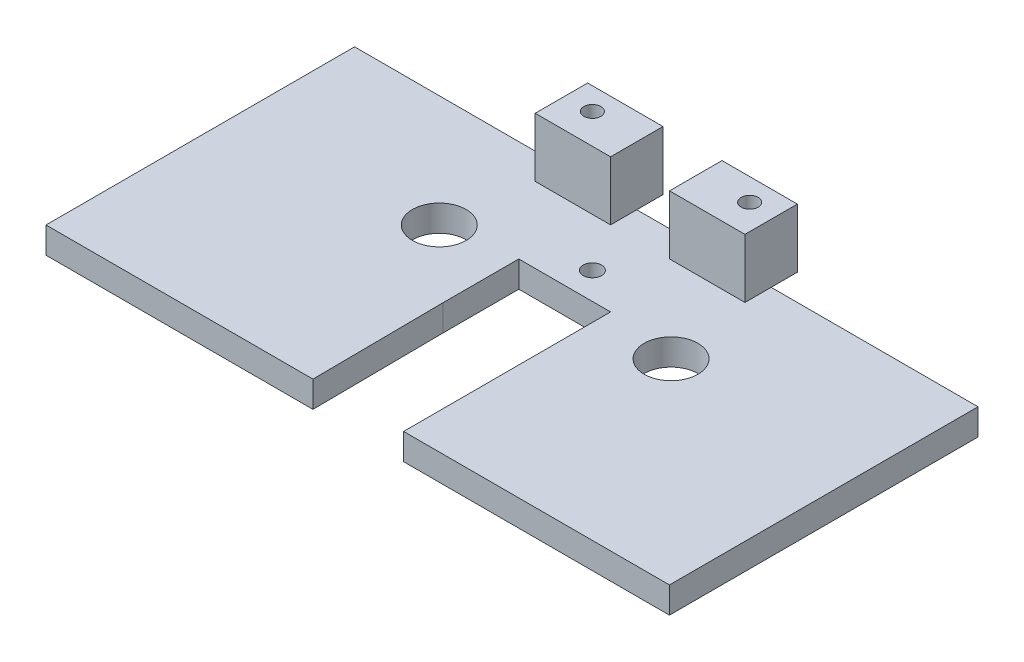
ISO-10303-21;
HEADER;
FILE_DESCRIPTION(('STEP AP214'),'2;1');
FILE_NAME('part.step','',(''),(''),'','','');
FILE_SCHEMA(('AUTOMOTIVE_DESIGN { 1 0 10303 214 1 1 1 1 }'));
ENDSEC;
DATA;
#1=APPLICATION_CONTEXT('core data for automotive mechanical design processes');
#2=APPLICATION_PROTOCOL_DEFINITION('international standard','automotive_design',2000,#1);
#3=PRODUCT_CONTEXT('',#1,'mechanical');
#4=PRODUCT('Part','Part','',(#3));
#5=PRODUCT_RELATED_PRODUCT_CATEGORY('part','',(#4));
#6=PRODUCT_DEFINITION_FORMATION('','',#4);
#7=PRODUCT_DEFINITION_CONTEXT('part definition',#1,'design');
#8=PRODUCT_DEFINITION('design','',#6,#7);
#9=PRODUCT_DEFINITION_SHAPE('','',#8);
#10=(LENGTH_UNIT() NAMED_UNIT(*) SI_UNIT(.MILLI.,.METRE.));
#11=(NAMED_UNIT(*) PLANE_ANGLE_UNIT() SI_UNIT($,.RADIAN.));
#12=(NAMED_UNIT(*) SI_UNIT($,.STERADIAN.) SOLID_ANGLE_UNIT());
#13=UNCERTAINTY_MEASURE_WITH_UNIT(LENGTH_MEASURE(1.E-05),#10,'distance_accuracy_value','');
#14=(GEOMETRIC_REPRESENTATION_CONTEXT(3) GLOBAL_UNCERTAINTY_ASSIGNED_CONTEXT((#13)) GLOBAL_UNIT_ASSIGNED_CONTEXT((#10,
#11,#12)) REPRESENTATION_CONTEXT('',''));
#15=CARTESIAN_POINT('',(0.,0.,0.));
#16=DIRECTION('',(0.,0.,1.));
#17=DIRECTION('',(1.,0.,0.));
#18=AXIS2_PLACEMENT_3D('',#15,#16,#17);
#19=CARTESIAN_POINT('',(-13.7785,2.,-6.76929));
#20=DIRECTION('',(0.,0.,1.));
#21=DIRECTION('',(1.,0.,0.));
#22=AXIS2_PLACEMENT_3D('',#19,#20,#21);
#23=PLANE('',#22);
#24=DIRECTION('',(-1.,0.,0.));
#25=VECTOR('',#24,1.);
#26=CARTESIAN_POINT('',(-13.7785,0.,-6.76929));
#27=LINE('',#26,#25);
#28=CARTESIAN_POINT('',(5.48337187026646,0.,-6.76929));
#29=VERTEX_POINT('',#28);
#30=CARTESIAN_POINT('',(-5.36337187026646,0.,-6.76929));
#31=VERTEX_POINT('',#30);
#32=EDGE_CURVE('E438',#29,#31,#27,.T.);
#33=ORIENTED_EDGE('',*,*,#32,.T.);
#34=DIRECTION('',(0.,1.,0.));
#35=VECTOR('',#34,1.);
#36=CARTESIAN_POINT('',(-5.36337187026646,0.,-6.76929));
#37=LINE('',#36,#35);
#38=CARTESIAN_POINT('',(-5.36337187026646,2.,-6.76929));
#39=VERTEX_POINT('',#38);
#40=EDGE_CURVE('E298',#31,#39,#37,.T.);
#41=ORIENTED_EDGE('',*,*,#40,.T.);
#42=DIRECTION('',(-1.,0.,0.));
#43=VECTOR('',#42,1.);
#44=CARTESIAN_POINT('',(-13.7785,2.,-6.76929));
#45=LINE('',#44,#43);
#46=CARTESIAN_POINT('',(-2.25,2.,-6.76929));
#47=VERTEX_POINT('',#46);
#48=EDGE_CURVE('E425',#47,#39,#45,.T.);
#49=ORIENTED_EDGE('',*,*,#48,.F.);
#50=CARTESIAN_POINT('',(2.25,2.,-6.76929));
#51=VERTEX_POINT('',#50);
#52=EDGE_CURVE('E491',#51,#47,#45,.T.);
#53=ORIENTED_EDGE('',*,*,#52,.F.);
#54=CARTESIAN_POINT('',(5.48337187026646,2.,-6.76929));
#55=VERTEX_POINT('',#54);
#56=EDGE_CURVE('E488',#55,#51,#45,.T.);
#57=ORIENTED_EDGE('',*,*,#56,.F.);
#58=DIRECTION('',(0.,1.,0.));
#59=VECTOR('',#58,1.);
#60=CARTESIAN_POINT('',(5.48337187026646,0.,-6.76929));
#61=LINE('',#60,#59);
#62=EDGE_CURVE('E66',#55,#29,#61,.F.);
#63=ORIENTED_EDGE('',*,*,#62,.T.);
#64=EDGE_LOOP('',(#33,#41,#49,#53,#57,#63));
#65=FACE_BOUND('',#64,.T.);
#66=ADVANCED_FACE('F43',(#65),#23,.F.);
#67=CARTESIAN_POINT('',(23.7785,0.,-6.76929));
#68=VERTEX_POINT('',#67);
#69=CARTESIAN_POINT('',(6.63662812973354,0.,-6.76929));
#70=VERTEX_POINT('',#69);
#71=EDGE_CURVE('E208',#68,#70,#27,.T.);
#72=ORIENTED_EDGE('',*,*,#71,.T.);
#73=DIRECTION('',(0.,1.,0.));
#74=VECTOR('',#73,1.);
#75=CARTESIAN_POINT('',(6.63662812973354,0.,-6.76929));
#76=LINE('',#75,#74);
#77=CARTESIAN_POINT('',(6.63662812973354,2.,-6.76929));
#78=VERTEX_POINT('',#77);
#79=EDGE_CURVE('E292',#70,#78,#76,.T.);
#80=ORIENTED_EDGE('',*,*,#79,.T.);
#81=CARTESIAN_POINT('',(8.,2.,-6.76929));
#82=VERTEX_POINT('',#81);
#83=EDGE_CURVE('E423',#82,#78,#45,.T.);
#84=ORIENTED_EDGE('',*,*,#83,.F.);
#85=CARTESIAN_POINT('',(23.7785,2.,-6.76929));
#86=VERTEX_POINT('',#85);
#87=EDGE_CURVE('E418',#86,#82,#45,.T.);
#88=ORIENTED_EDGE('',*,*,#87,.F.);
#89=DIRECTION('',(0.,1.,0.));
#90=VECTOR('',#89,1.);
#91=CARTESIAN_POINT('',(23.7785,-31.1249894565725,-6.76929));
#92=LINE('',#91,#90);
#93=EDGE_CURVE('E214',#68,#86,#92,.T.);
#94=ORIENTED_EDGE('',*,*,#93,.F.);
#95=EDGE_LOOP('',(#72,#80,#84,#88,#94));
#96=FACE_BOUND('',#95,.T.);
#97=ADVANCED_FACE('F521',(#96),#23,.F.);
#98=CARTESIAN_POINT('',(0.,2.,0.));
#99=DIRECTION('',(0.,-1.,0.));
#100=DIRECTION('',(0.,0.,-1.));
#101=AXIS2_PLACEMENT_3D('',#98,#99,#100);
#102=PLANE('',#101);
#103=DIRECTION('',(0.,0.,-1.));
#104=VECTOR('',#103,1.);
#105=CARTESIAN_POINT('',(23.7785,2.,16.7689191752585));
#106=LINE('',#105,#104);
#107=CARTESIAN_POINT('',(23.7785,2.,16.7689191752585));
#108=VERTEX_POINT('',#107);
#109=EDGE_CURVE('E219',#108,#86,#106,.T.);
#110=ORIENTED_EDGE('',*,*,#109,.T.);
#111=ORIENTED_EDGE('',*,*,#87,.T.);
#112=DIRECTION('',(0.,0.,-1.));
#113=VECTOR('',#112,1.);
#114=CARTESIAN_POINT('',(8.,2.,-4.76929));
#115=LINE('',#114,#113);
#116=CARTESIAN_POINT('',(8.,2.,-4.76929));
#117=VERTEX_POINT('',#116);
#118=EDGE_CURVE('E333',#117,#82,#115,.T.);
#119=ORIENTED_EDGE('',*,*,#118,.F.);
#120=DIRECTION('',(1.,0.,0.));
#121=VECTOR('',#120,1.);
#122=CARTESIAN_POINT('',(2.25,2.,-4.76929));
#123=LINE('',#122,#121);
#124=CARTESIAN_POINT('',(2.25,2.,-4.76929));
#125=VERTEX_POINT('',#124);
#126=EDGE_CURVE('E319',#125,#117,#123,.T.);
#127=ORIENTED_EDGE('',*,*,#126,.F.);
#128=DIRECTION('',(0.,0.,1.));
#129=VECTOR('',#128,1.);
#130=CARTESIAN_POINT('',(2.25,2.,-4.76929));
#131=LINE('',#130,#129);
#132=EDGE_CURVE('E323',#51,#125,#131,.T.);
#133=ORIENTED_EDGE('',*,*,#132,.F.);
#134=ORIENTED_EDGE('',*,*,#52,.T.);
#135=DIRECTION('',(0.,0.,-1.));
#136=VECTOR('',#135,1.);
#137=CARTESIAN_POINT('',(-2.25,2.,-4.76929));
#138=LINE('',#137,#136);
#139=CARTESIAN_POINT('',(-2.25,2.,-4.76929));
#140=VERTEX_POINT('',#139);
#141=EDGE_CURVE('E364',#140,#47,#138,.T.);
#142=ORIENTED_EDGE('',*,*,#141,.F.);
#143=DIRECTION('',(1.,0.,0.));
#144=VECTOR('',#143,1.);
#145=CARTESIAN_POINT('',(-8.,2.,-4.76929));
#146=LINE('',#145,#144);
#147=CARTESIAN_POINT('',(-8.,2.,-4.76929));
#148=VERTEX_POINT('',#147);
#149=EDGE_CURVE('E354',#148,#140,#146,.T.);
#150=ORIENTED_EDGE('',*,*,#149,.F.);
#151=DIRECTION('',(0.,0.,1.));
#152=VECTOR('',#151,1.);
#153=CARTESIAN_POINT('',(-8.,2.,-4.76929));
#154=LINE('',#153,#152);
#155=CARTESIAN_POINT('',(-8.,2.,-6.76929));
#156=VERTEX_POINT('',#155);
#157=EDGE_CURVE('E52',#156,#148,#154,.T.);
#158=ORIENTED_EDGE('',*,*,#157,.F.);
#159=CARTESIAN_POINT('',(-23.7785,2.,-6.76929));
#160=VERTEX_POINT('',#159);
#161=EDGE_CURVE('E447',#156,#160,#45,.T.);
#162=ORIENTED_EDGE('',*,*,#161,.T.);
#163=DIRECTION('',(0.,0.,1.));
#164=VECTOR('',#163,1.);
#165=CARTESIAN_POINT('',(-23.7785,2.,-6.76929));
#166=LINE('',#165,#164);
#167=CARTESIAN_POINT('',(-23.7785,2.,16.7689191752585));
#168=VERTEX_POINT('',#167);
#169=EDGE_CURVE('E237',#160,#168,#166,.T.);
#170=ORIENTED_EDGE('',*,*,#169,.T.);
#171=DIRECTION('',(1.,0.,0.));
#172=VECTOR('',#171,1.);
#173=CARTESIAN_POINT('',(-23.7785,2.,16.7689191752585));
#174=LINE('',#173,#172);
#175=CARTESIAN_POINT('',(-3.4138817248266,2.,16.7689191752585));
#176=VERTEX_POINT('',#175);
#177=EDGE_CURVE('E245',#168,#176,#174,.T.);
#178=ORIENTED_EDGE('',*,*,#177,.T.);
#179=DIRECTION('',(-0.00861182751733945,0.,-0.999962917525851));
#180=VECTOR('',#179,1.);
#181=CARTESIAN_POINT('',(-3.4138817248266,2.,16.7689191752585));
#182=LINE('',#181,#180);
#183=CARTESIAN_POINT('',(-3.5,2.,6.76929));
#184=VERTEX_POINT('',#183);
#185=EDGE_CURVE('E240',#176,#184,#182,.T.);
#186=ORIENTED_EDGE('',*,*,#185,.T.);
#187=DIRECTION('',(0.,0.,-1.));
#188=VECTOR('',#187,1.);
#189=CARTESIAN_POINT('',(-3.5,2.,6.76929));
#190=LINE('',#189,#188);
#191=CARTESIAN_POINT('',(-3.5,2.,0.980710000000001));
#192=VERTEX_POINT('',#191);
#193=EDGE_CURVE('E422',#184,#192,#190,.T.);
#194=ORIENTED_EDGE('',*,*,#193,.T.);
#195=DIRECTION('',(1.,0.,0.));
#196=VECTOR('',#195,1.);
#197=CARTESIAN_POINT('',(-3.5,2.,0.980710000000001));
#198=LINE('',#197,#196);
#199=CARTESIAN_POINT('',(3.5,2.,0.98071));
#200=VERTEX_POINT('',#199);
#201=EDGE_CURVE('E428',#192,#200,#198,.T.);
#202=ORIENTED_EDGE('',*,*,#201,.T.);
#203=DIRECTION('',(0.,0.,1.));
#204=VECTOR('',#203,1.);
#205=CARTESIAN_POINT('',(3.5,2.,0.98071));
#206=LINE('',#205,#204);
#207=CARTESIAN_POINT('',(3.5,2.,16.7689191752585));
#208=VERTEX_POINT('',#207);
#209=EDGE_CURVE('E431',#200,#208,#206,.T.);
#210=ORIENTED_EDGE('',*,*,#209,.T.);
#211=DIRECTION('',(1.,0.,0.));
#212=VECTOR('',#211,1.);
#213=CARTESIAN_POINT('',(3.5,2.,16.7689191752585));
#214=LINE('',#213,#212);
#215=EDGE_CURVE('E234',#208,#108,#214,.T.);
#216=ORIENTED_EDGE('',*,*,#215,.T.);
#217=EDGE_LOOP('',(#110,#111,#119,#127,#133,#134,#142,#150,#158,#162,#170,#178,#186,#194,#202,
#210,#216));
#218=FACE_BOUND('',#217,.T.);
#219=CARTESIAN_POINT('',(-8.7785,2.,1.76929));
#220=DIRECTION('',(0.,1.,0.));
#221=DIRECTION('',(0.,0.,1.));
#222=AXIS2_PLACEMENT_3D('',#219,#220,#221);
#223=CIRCLE('',#222,2.05);
#224=CARTESIAN_POINT('',(-8.7785,2.,3.81929));
#225=VERTEX_POINT('',#224);
#226=EDGE_CURVE('E410',#225,#225,#223,.T.);
#227=ORIENTED_EDGE('',*,*,#226,.F.);
#228=EDGE_LOOP('',(#227));
#229=FACE_BOUND('',#228,.T.);
#230=CARTESIAN_POINT('',(8.9015,2.,1.76929));
#231=DIRECTION('',(0.,1.,0.));
#232=DIRECTION('',(0.,0.,1.));
#233=AXIS2_PLACEMENT_3D('',#230,#231,#232);
#234=CIRCLE('',#233,2.05);
#235=CARTESIAN_POINT('',(8.9015,2.,3.81929));
#236=VERTEX_POINT('',#235);
#237=EDGE_CURVE('E402',#236,#236,#234,.T.);
#238=ORIENTED_EDGE('',*,*,#237,.F.);
#239=EDGE_LOOP('',(#238));
#240=FACE_BOUND('',#239,.T.);
#241=CARTESIAN_POINT('',(0.0584999999999978,2.,-1.07400228));
#242=DIRECTION('',(0.,1.,0.));
#243=DIRECTION('',(0.,0.,1.));
#244=AXIS2_PLACEMENT_3D('',#241,#242,#243);
#245=CIRCLE('',#244,0.700643724536634);
#246=CARTESIAN_POINT('',(0.0584999999999978,2.,-0.373358555463365));
#247=VERTEX_POINT('',#246);
#248=EDGE_CURVE('E394',#247,#247,#245,.T.);
#249=ORIENTED_EDGE('',*,*,#248,.F.);
#250=EDGE_LOOP('',(#249));
#251=FACE_BOUND('',#250,.T.);
#252=ADVANCED_FACE('F502',(#218,#229,#240,#251),#102,.F.);
#253=CARTESIAN_POINT('',(0.,0.,0.));
#254=DIRECTION('',(0.,-1.,0.));
#255=DIRECTION('',(0.,0.,-1.));
#256=AXIS2_PLACEMENT_3D('',#253,#254,#255);
#257=PLANE('',#256);
#258=ORIENTED_EDGE('',*,*,#71,.F.);
#259=DIRECTION('',(0.,0.,-1.));
#260=VECTOR('',#259,1.);
#261=CARTESIAN_POINT('',(23.7785,0.,16.7689191752585));
#262=LINE('',#261,#260);
#263=CARTESIAN_POINT('',(23.7785,0.,16.7689191752585));
#264=VERTEX_POINT('',#263);
#265=EDGE_CURVE('E198',#264,#68,#262,.T.);
#266=ORIENTED_EDGE('',*,*,#265,.F.);
#267=DIRECTION('',(1.,0.,0.));
#268=VECTOR('',#267,1.);
#269=CARTESIAN_POINT('',(3.5,0.,16.7689191752585));
#270=LINE('',#269,#268);
#271=CARTESIAN_POINT('',(3.5,0.,16.7689191752585));
#272=VERTEX_POINT('',#271);
#273=EDGE_CURVE('E204',#272,#264,#270,.T.);
#274=ORIENTED_EDGE('',*,*,#273,.F.);
#275=DIRECTION('',(0.,0.,1.));
#276=VECTOR('',#275,1.);
#277=CARTESIAN_POINT('',(3.5,0.,0.98071));
#278=LINE('',#277,#276);
#279=CARTESIAN_POINT('',(3.5,0.,0.98071));
#280=VERTEX_POINT('',#279);
#281=EDGE_CURVE('E444',#280,#272,#278,.T.);
#282=ORIENTED_EDGE('',*,*,#281,.F.);
#283=DIRECTION('',(1.,0.,0.));
#284=VECTOR('',#283,1.);
#285=CARTESIAN_POINT('',(-3.5,0.,0.980710000000001));
#286=LINE('',#285,#284);
#287=CARTESIAN_POINT('',(-3.5,0.,0.980710000000001));
#288=VERTEX_POINT('',#287);
#289=EDGE_CURVE('E441',#288,#280,#286,.T.);
#290=ORIENTED_EDGE('',*,*,#289,.F.);
#291=DIRECTION('',(0.,0.,-1.));
#292=VECTOR('',#291,1.);
#293=CARTESIAN_POINT('',(-3.5,0.,6.76929));
#294=LINE('',#293,#292);
#295=CARTESIAN_POINT('',(-3.5,0.,6.76929));
#296=VERTEX_POINT('',#295);
#297=EDGE_CURVE('E437',#296,#288,#294,.T.);
#298=ORIENTED_EDGE('',*,*,#297,.F.);
#299=DIRECTION('',(-0.00861182751733945,0.,-0.999962917525851));
#300=VECTOR('',#299,1.);
#301=CARTESIAN_POINT('',(-3.4138817248266,0.,16.7689191752585));
#302=LINE('',#301,#300);
#303=CARTESIAN_POINT('',(-3.41388172482661,0.,16.7689191752585));
#304=VERTEX_POINT('',#303);
#305=EDGE_CURVE('E252',#304,#296,#302,.T.);
#306=ORIENTED_EDGE('',*,*,#305,.F.);
#307=DIRECTION('',(1.,0.,0.));
#308=VECTOR('',#307,1.);
#309=CARTESIAN_POINT('',(-23.7785,0.,16.7689191752585));
#310=LINE('',#309,#308);
#311=CARTESIAN_POINT('',(-23.7785,0.,16.7689191752585));
#312=VERTEX_POINT('',#311);
#313=EDGE_CURVE('E257',#312,#304,#310,.T.);
#314=ORIENTED_EDGE('',*,*,#313,.F.);
#315=DIRECTION('',(0.,0.,1.));
#316=VECTOR('',#315,1.);
#317=CARTESIAN_POINT('',(-23.7785,0.,-6.76929));
#318=LINE('',#317,#316);
#319=CARTESIAN_POINT('',(-23.7785,0.,-6.76929));
#320=VERTEX_POINT('',#319);
#321=EDGE_CURVE('E262',#320,#312,#318,.T.);
#322=ORIENTED_EDGE('',*,*,#321,.F.);
#323=CARTESIAN_POINT('',(-6.51662812973354,0.,-6.76929));
#324=VERTEX_POINT('',#323);
#325=EDGE_CURVE('E414',#324,#320,#27,.T.);
#326=ORIENTED_EDGE('',*,*,#325,.F.);
#327=CARTESIAN_POINT('',(-5.94,0.,-7.06929));
#328=DIRECTION('',(0.,1.,0.));
#329=DIRECTION('',(0.,0.,1.));
#330=AXIS2_PLACEMENT_3D('',#327,#328,#329);
#331=CIRCLE('',#330,0.649999999999999);
#332=EDGE_CURVE('E273',#324,#31,#331,.T.);
#333=ORIENTED_EDGE('',*,*,#332,.T.);
#334=ORIENTED_EDGE('',*,*,#32,.F.);
#335=CARTESIAN_POINT('',(6.06,0.,-7.06929));
#336=DIRECTION('',(0.,1.,0.));
#337=DIRECTION('',(0.,0.,1.));
#338=AXIS2_PLACEMENT_3D('',#335,#336,#337);
#339=CIRCLE('',#338,0.649999999999999);
#340=EDGE_CURVE('E255',#29,#70,#339,.T.);
#341=ORIENTED_EDGE('',*,*,#340,.T.);
#342=EDGE_LOOP('',(#258,#266,#274,#282,#290,#298,#306,#314,#322,#326,#333,#334,#341));
#343=FACE_BOUND('',#342,.T.);
#344=CARTESIAN_POINT('',(8.9015,0.,1.76929));
#345=DIRECTION('',(0.,1.,0.));
#346=DIRECTION('',(0.,0.,1.));
#347=AXIS2_PLACEMENT_3D('',#344,#345,#346);
#348=CIRCLE('',#347,2.05);
#349=CARTESIAN_POINT('',(8.9015,0.,3.81929));
#350=VERTEX_POINT('',#349);
#351=EDGE_CURVE('E398',#350,#350,#348,.T.);
#352=ORIENTED_EDGE('',*,*,#351,.T.);
#353=EDGE_LOOP('',(#352));
#354=FACE_BOUND('',#353,.T.);
#355=CARTESIAN_POINT('',(-8.7785,0.,1.76929));
#356=DIRECTION('',(0.,1.,0.));
#357=DIRECTION('',(0.,0.,1.));
#358=AXIS2_PLACEMENT_3D('',#355,#356,#357);
#359=CIRCLE('',#358,2.05);
#360=CARTESIAN_POINT('',(-8.7785,0.,3.81929));
#361=VERTEX_POINT('',#360);
#362=EDGE_CURVE('E406',#361,#361,#359,.T.);
#363=ORIENTED_EDGE('',*,*,#362,.T.);
#364=EDGE_LOOP('',(#363));
#365=FACE_BOUND('',#364,.T.);
#366=CARTESIAN_POINT('',(0.0584999999999978,0.,-1.07400228));
#367=DIRECTION('',(0.,1.,0.));
#368=DIRECTION('',(0.,0.,1.));
#369=AXIS2_PLACEMENT_3D('',#366,#367,#368);
#370=CIRCLE('',#369,0.700643724536634);
#371=CARTESIAN_POINT('',(0.0584999999999978,0.,-0.373358555463365));
#372=VERTEX_POINT('',#371);
#373=EDGE_CURVE('E393',#372,#372,#370,.T.);
#374=ORIENTED_EDGE('',*,*,#373,.T.);
#375=EDGE_LOOP('',(#374));
#376=FACE_BOUND('',#375,.T.);
#377=ADVANCED_FACE('F200',(#343,#354,#365,#376),#257,.T.);
#378=CARTESIAN_POINT('',(-6.51662812973354,2.,-6.76929));
#379=VERTEX_POINT('',#378);
#380=EDGE_CURVE('E424',#379,#156,#45,.T.);
#381=ORIENTED_EDGE('',*,*,#380,.F.);
#382=DIRECTION('',(0.,1.,0.));
#383=VECTOR('',#382,1.);
#384=CARTESIAN_POINT('',(-6.51662812973354,0.,-6.76929));
#385=LINE('',#384,#383);
#386=EDGE_CURVE('E58',#379,#324,#385,.F.);
#387=ORIENTED_EDGE('',*,*,#386,.T.);
#388=ORIENTED_EDGE('',*,*,#325,.T.);
#389=DIRECTION('',(0.,1.,0.));
#390=VECTOR('',#389,1.);
#391=CARTESIAN_POINT('',(-23.7785,-31.1249894565725,-6.76929));
#392=LINE('',#391,#390);
#393=EDGE_CURVE('E244',#320,#160,#392,.T.);
#394=ORIENTED_EDGE('',*,*,#393,.T.);
#395=ORIENTED_EDGE('',*,*,#161,.F.);
#396=EDGE_LOOP('',(#381,#387,#388,#394,#395));
#397=FACE_BOUND('',#396,.T.);
#398=ADVANCED_FACE('F45',(#397),#23,.F.);
#399=CARTESIAN_POINT('',(-3.5,2.,6.76929));
#400=DIRECTION('',(-1.,0.,0.));
#401=DIRECTION('',(0.,0.,1.));
#402=AXIS2_PLACEMENT_3D('',#399,#400,#401);
#403=PLANE('',#402);
#404=ORIENTED_EDGE('',*,*,#297,.T.);
#405=DIRECTION('',(0.,-1.,0.));
#406=VECTOR('',#405,1.);
#407=CARTESIAN_POINT('',(-3.5,2.,0.980710000000001));
#408=LINE('',#407,#406);
#409=EDGE_CURVE('E451',#192,#288,#408,.T.);
#410=ORIENTED_EDGE('',*,*,#409,.F.);
#411=ORIENTED_EDGE('',*,*,#193,.F.);
#412=DIRECTION('',(0.,-1.,0.));
#413=VECTOR('',#412,1.);
#414=CARTESIAN_POINT('',(-3.5,2.,6.76929));
#415=LINE('',#414,#413);
#416=EDGE_CURVE('E454',#184,#296,#415,.T.);
#417=ORIENTED_EDGE('',*,*,#416,.T.);
#418=EDGE_LOOP('',(#404,#410,#411,#417));
#419=FACE_BOUND('',#418,.T.);
#420=ADVANCED_FACE('F527',(#419),#403,.F.);
#421=CARTESIAN_POINT('',(-3.5,2.,0.980710000000001));
#422=DIRECTION('',(0.,0.,-1.));
#423=DIRECTION('',(-1.,0.,0.));
#424=AXIS2_PLACEMENT_3D('',#421,#422,#423);
#425=PLANE('',#424);
#426=ORIENTED_EDGE('',*,*,#289,.T.);
#427=DIRECTION('',(0.,-1.,0.));
#428=VECTOR('',#427,1.);
#429=CARTESIAN_POINT('',(3.5,2.,0.98071));
#430=LINE('',#429,#428);
#431=EDGE_CURVE('E434',#200,#280,#430,.T.);
#432=ORIENTED_EDGE('',*,*,#431,.F.);
#433=ORIENTED_EDGE('',*,*,#201,.F.);
#434=ORIENTED_EDGE('',*,*,#409,.T.);
#435=EDGE_LOOP('',(#426,#432,#433,#434));
#436=FACE_BOUND('',#435,.T.);
#437=ADVANCED_FACE('F532',(#436),#425,.F.);
#438=CARTESIAN_POINT('',(3.5,2.,0.98071));
#439=DIRECTION('',(1.,0.,0.));
#440=DIRECTION('',(0.,0.,-1.));
#441=AXIS2_PLACEMENT_3D('',#438,#439,#440);
#442=PLANE('',#441);
#443=ORIENTED_EDGE('',*,*,#281,.T.);
#444=DIRECTION('',(0.,1.,0.));
#445=VECTOR('',#444,1.);
#446=CARTESIAN_POINT('',(3.5,-31.1249894565725,16.7689191752585));
#447=LINE('',#446,#445);
#448=EDGE_CURVE('E227',#272,#208,#447,.T.);
#449=ORIENTED_EDGE('',*,*,#448,.T.);
#450=ORIENTED_EDGE('',*,*,#209,.F.);
#451=ORIENTED_EDGE('',*,*,#431,.T.);
#452=EDGE_LOOP('',(#443,#449,#450,#451));
#453=FACE_BOUND('',#452,.T.);
#454=ADVANCED_FACE('F540',(#453),#442,.F.);
#455=CARTESIAN_POINT('',(-8.7785,2.,1.76929));
#456=DIRECTION('',(0.,-1.,0.));
#457=DIRECTION('',(0.,0.,-1.));
#458=AXIS2_PLACEMENT_3D('',#455,#456,#457);
#459=CYLINDRICAL_SURFACE('',#458,2.05);
#460=ORIENTED_EDGE('',*,*,#226,.T.);
#461=EDGE_LOOP('',(#460));
#462=FACE_BOUND('',#461,.T.);
#463=ORIENTED_EDGE('',*,*,#362,.F.);
#464=EDGE_LOOP('',(#463));
#465=FACE_BOUND('',#464,.T.);
#466=ADVANCED_FACE('F543',(#462,#465),#459,.F.);
#467=CARTESIAN_POINT('',(8.9015,2.,1.76929));
#468=DIRECTION('',(0.,-1.,0.));
#469=DIRECTION('',(0.,0.,-1.));
#470=AXIS2_PLACEMENT_3D('',#467,#468,#469);
#471=CYLINDRICAL_SURFACE('',#470,2.05);
#472=ORIENTED_EDGE('',*,*,#237,.T.);
#473=EDGE_LOOP('',(#472));
#474=FACE_BOUND('',#473,.T.);
#475=ORIENTED_EDGE('',*,*,#351,.F.);
#476=EDGE_LOOP('',(#475));
#477=FACE_BOUND('',#476,.T.);
#478=ADVANCED_FACE('F839',(#474,#477),#471,.F.);
#479=CARTESIAN_POINT('',(0.0584999999999978,2.,-1.07400228));
#480=DIRECTION('',(0.,-1.,0.));
#481=DIRECTION('',(0.,0.,-1.));
#482=AXIS2_PLACEMENT_3D('',#479,#480,#481);
#483=CYLINDRICAL_SURFACE('',#482,0.700643724536634);
#484=ORIENTED_EDGE('',*,*,#248,.T.);
#485=EDGE_LOOP('',(#484));
#486=FACE_BOUND('',#485,.T.);
#487=ORIENTED_EDGE('',*,*,#373,.F.);
#488=EDGE_LOOP('',(#487));
#489=FACE_BOUND('',#488,.T.);
#490=ADVANCED_FACE('F518',(#486,#489),#483,.F.);
#491=CARTESIAN_POINT('',(-2.25,6.5,-4.76929));
#492=DIRECTION('',(-1.,0.,0.));
#493=DIRECTION('',(0.,0.,1.));
#494=AXIS2_PLACEMENT_3D('',#491,#492,#493);
#495=PLANE('',#494);
#496=ORIENTED_EDGE('',*,*,#141,.T.);
#497=CARTESIAN_POINT('',(-2.25,2.,-8.76929));
#498=VERTEX_POINT('',#497);
#499=EDGE_CURVE('E337',#47,#498,#138,.T.);
#500=ORIENTED_EDGE('',*,*,#499,.T.);
#501=DIRECTION('',(0.,-1.,0.));
#502=VECTOR('',#501,1.);
#503=CARTESIAN_POINT('',(-2.25,6.5,-8.76929));
#504=LINE('',#503,#502);
#505=CARTESIAN_POINT('',(-2.25,6.5,-8.76929));
#506=VERTEX_POINT('',#505);
#507=EDGE_CURVE('E389',#506,#498,#504,.T.);
#508=ORIENTED_EDGE('',*,*,#507,.F.);
#509=DIRECTION('',(0.,0.,-1.));
#510=VECTOR('',#509,1.);
#511=CARTESIAN_POINT('',(-2.25,6.5,-4.76929));
#512=LINE('',#511,#510);
#513=CARTESIAN_POINT('',(-2.25,6.5,-4.76929));
#514=VERTEX_POINT('',#513);
#515=EDGE_CURVE('E349',#514,#506,#512,.T.);
#516=ORIENTED_EDGE('',*,*,#515,.F.);
#517=DIRECTION('',(0.,-1.,0.));
#518=VECTOR('',#517,1.);
#519=CARTESIAN_POINT('',(-2.25,6.5,-4.76929));
#520=LINE('',#519,#518);
#521=EDGE_CURVE('E363',#514,#140,#520,.T.);
#522=ORIENTED_EDGE('',*,*,#521,.T.);
#523=EDGE_LOOP('',(#496,#500,#508,#516,#522));
#524=FACE_BOUND('',#523,.T.);
#525=ADVANCED_FACE('F509',(#524),#495,.F.);
#526=CARTESIAN_POINT('',(-8.,6.5,-8.76929));
#527=DIRECTION('',(0.,0.,1.));
#528=DIRECTION('',(1.,0.,0.));
#529=AXIS2_PLACEMENT_3D('',#526,#527,#528);
#530=PLANE('',#529);
#531=DIRECTION('',(-1.,0.,0.));
#532=VECTOR('',#531,1.);
#533=CARTESIAN_POINT('',(-8.,2.,-8.76929));
#534=LINE('',#533,#532);
#535=CARTESIAN_POINT('',(-8.,2.,-8.76929));
#536=VERTEX_POINT('',#535);
#537=EDGE_CURVE('E368',#498,#536,#534,.T.);
#538=ORIENTED_EDGE('',*,*,#537,.T.);
#539=DIRECTION('',(0.,-1.,0.));
#540=VECTOR('',#539,1.);
#541=CARTESIAN_POINT('',(-8.,6.5,-8.76929));
#542=LINE('',#541,#540);
#543=CARTESIAN_POINT('',(-8.,6.5,-8.76929));
#544=VERTEX_POINT('',#543);
#545=EDGE_CURVE('E385',#544,#536,#542,.T.);
#546=ORIENTED_EDGE('',*,*,#545,.F.);
#547=DIRECTION('',(-1.,0.,0.));
#548=VECTOR('',#547,1.);
#549=CARTESIAN_POINT('',(-8.,6.5,-8.76929));
#550=LINE('',#549,#548);
#551=EDGE_CURVE('E353',#506,#544,#550,.T.);
#552=ORIENTED_EDGE('',*,*,#551,.F.);
#553=ORIENTED_EDGE('',*,*,#507,.T.);
#554=EDGE_LOOP('',(#538,#546,#552,#553));
#555=FACE_BOUND('',#554,.T.);
#556=ADVANCED_FACE('F510',(#555),#530,.F.);
#557=CARTESIAN_POINT('',(-8.,6.5,-4.76929));
#558=DIRECTION('',(1.,0.,0.));
#559=DIRECTION('',(0.,0.,-1.));
#560=AXIS2_PLACEMENT_3D('',#557,#558,#559);
#561=PLANE('',#560);
#562=EDGE_CURVE('E371',#536,#156,#154,.T.);
#563=ORIENTED_EDGE('',*,*,#562,.T.);
#564=ORIENTED_EDGE('',*,*,#157,.T.);
#565=DIRECTION('',(0.,-1.,0.));
#566=VECTOR('',#565,1.);
#567=CARTESIAN_POINT('',(-8.,6.5,-4.76929));
#568=LINE('',#567,#566);
#569=CARTESIAN_POINT('',(-8.,6.5,-4.76929));
#570=VERTEX_POINT('',#569);
#571=EDGE_CURVE('E381',#570,#148,#568,.T.);
#572=ORIENTED_EDGE('',*,*,#571,.F.);
#573=DIRECTION('',(0.,0.,1.));
#574=VECTOR('',#573,1.);
#575=CARTESIAN_POINT('',(-8.,6.5,-4.76929));
#576=LINE('',#575,#574);
#577=EDGE_CURVE('E357',#544,#570,#576,.T.);
#578=ORIENTED_EDGE('',*,*,#577,.F.);
#579=ORIENTED_EDGE('',*,*,#545,.T.);
#580=EDGE_LOOP('',(#563,#564,#572,#578,#579));
#581=FACE_BOUND('',#580,.T.);
#582=ADVANCED_FACE('F465',(#581),#561,.F.);
#583=CARTESIAN_POINT('',(-8.,6.5,-4.76929));
#584=DIRECTION('',(0.,0.,-1.));
#585=DIRECTION('',(-1.,0.,0.));
#586=AXIS2_PLACEMENT_3D('',#583,#584,#585);
#587=PLANE('',#586);
#588=ORIENTED_EDGE('',*,*,#149,.T.);
#589=ORIENTED_EDGE('',*,*,#521,.F.);
#590=DIRECTION('',(1.,0.,0.));
#591=VECTOR('',#590,1.);
#592=CARTESIAN_POINT('',(-8.,6.5,-4.76929));
#593=LINE('',#592,#591);
#594=EDGE_CURVE('E360',#570,#514,#593,.T.);
#595=ORIENTED_EDGE('',*,*,#594,.F.);
#596=ORIENTED_EDGE('',*,*,#571,.T.);
#597=EDGE_LOOP('',(#588,#589,#595,#596));
#598=FACE_BOUND('',#597,.T.);
#599=ADVANCED_FACE('F472',(#598),#587,.F.);
#600=CARTESIAN_POINT('',(0.,6.5,0.));
#601=DIRECTION('',(0.,-1.,0.));
#602=DIRECTION('',(0.,0.,-1.));
#603=AXIS2_PLACEMENT_3D('',#600,#601,#602);
#604=PLANE('',#603);
#605=CARTESIAN_POINT('',(-5.94,6.5,-7.06929));
#606=DIRECTION('',(0.,1.,0.));
#607=DIRECTION('',(0.,0.,1.));
#608=AXIS2_PLACEMENT_3D('',#605,#606,#607);
#609=CIRCLE('',#608,0.649999999999999);
#610=CARTESIAN_POINT('',(-5.94,6.5,-6.41929));
#611=VERTEX_POINT('',#610);
#612=EDGE_CURVE('E278',#611,#611,#609,.T.);
#613=ORIENTED_EDGE('',*,*,#612,.F.);
#614=EDGE_LOOP('',(#613));
#615=FACE_BOUND('',#614,.T.);
#616=ORIENTED_EDGE('',*,*,#515,.T.);
#617=ORIENTED_EDGE('',*,*,#551,.T.);
#618=ORIENTED_EDGE('',*,*,#577,.T.);
#619=ORIENTED_EDGE('',*,*,#594,.T.);
#620=EDGE_LOOP('',(#616,#617,#618,#619));
#621=FACE_BOUND('',#620,.T.);
#622=ADVANCED_FACE('F476',(#615,#621),#604,.F.);
#623=CARTESIAN_POINT('',(0.,2.,0.));
#624=DIRECTION('',(0.,-1.,0.));
#625=DIRECTION('',(0.,0.,-1.));
#626=AXIS2_PLACEMENT_3D('',#623,#624,#625);
#627=PLANE('',#626);
#628=CARTESIAN_POINT('',(-5.94,2.,-7.06929));
#629=DIRECTION('',(0.,-1.,0.));
#630=DIRECTION('',(0.,0.,-1.));
#631=AXIS2_PLACEMENT_3D('',#628,#629,#630);
#632=CIRCLE('',#631,0.649999999999999);
#633=EDGE_CURVE('E11',#379,#39,#632,.T.);
#634=ORIENTED_EDGE('',*,*,#633,.F.);
#635=ORIENTED_EDGE('',*,*,#380,.T.);
#636=ORIENTED_EDGE('',*,*,#562,.F.);
#637=ORIENTED_EDGE('',*,*,#537,.F.);
#638=ORIENTED_EDGE('',*,*,#499,.F.);
#639=ORIENTED_EDGE('',*,*,#48,.T.);
#640=EDGE_LOOP('',(#634,#635,#636,#637,#638,#639));
#641=FACE_BOUND('',#640,.T.);
#642=ADVANCED_FACE('F482',(#641),#627,.T.);
#643=CARTESIAN_POINT('',(0.,2.,0.));
#644=DIRECTION('',(0.,-1.,0.));
#645=DIRECTION('',(0.,0.,-1.));
#646=AXIS2_PLACEMENT_3D('',#643,#644,#645);
#647=PLANE('',#646);
#648=CARTESIAN_POINT('',(6.06,2.,-7.06929));
#649=DIRECTION('',(0.,-1.,0.));
#650=DIRECTION('',(0.,0.,-1.));
#651=AXIS2_PLACEMENT_3D('',#648,#649,#650);
#652=CIRCLE('',#651,0.649999999999999);
#653=EDGE_CURVE('E277',#55,#78,#652,.T.);
#654=ORIENTED_EDGE('',*,*,#653,.F.);
#655=ORIENTED_EDGE('',*,*,#56,.T.);
#656=CARTESIAN_POINT('',(2.25,2.,-8.76929));
#657=VERTEX_POINT('',#656);
#658=EDGE_CURVE('E325',#657,#51,#131,.T.);
#659=ORIENTED_EDGE('',*,*,#658,.F.);
#660=DIRECTION('',(-1.,0.,0.));
#661=VECTOR('',#660,1.);
#662=CARTESIAN_POINT('',(2.25,2.,-8.76929));
#663=LINE('',#662,#661);
#664=CARTESIAN_POINT('',(8.,2.,-8.76929));
#665=VERTEX_POINT('',#664);
#666=EDGE_CURVE('E329',#665,#657,#663,.T.);
#667=ORIENTED_EDGE('',*,*,#666,.F.);
#668=EDGE_CURVE('E332',#82,#665,#115,.T.);
#669=ORIENTED_EDGE('',*,*,#668,.F.);
#670=ORIENTED_EDGE('',*,*,#83,.T.);
#671=EDGE_LOOP('',(#654,#655,#659,#667,#669,#670));
#672=FACE_BOUND('',#671,.T.);
#673=ADVANCED_FACE('F574',(#672),#647,.T.);
#674=CARTESIAN_POINT('',(8.,6.5,-4.76929));
#675=DIRECTION('',(-1.,0.,0.));
#676=DIRECTION('',(0.,0.,1.));
#677=AXIS2_PLACEMENT_3D('',#674,#675,#676);
#678=PLANE('',#677);
#679=ORIENTED_EDGE('',*,*,#118,.T.);
#680=ORIENTED_EDGE('',*,*,#668,.T.);
#681=DIRECTION('',(0.,-1.,0.));
#682=VECTOR('',#681,1.);
#683=CARTESIAN_POINT('',(8.,6.5,-8.76929));
#684=LINE('',#683,#682);
#685=CARTESIAN_POINT('',(8.,6.5,-8.76929));
#686=VERTEX_POINT('',#685);
#687=EDGE_CURVE('E302',#686,#665,#684,.T.);
#688=ORIENTED_EDGE('',*,*,#687,.F.);
#689=DIRECTION('',(0.,0.,-1.));
#690=VECTOR('',#689,1.);
#691=CARTESIAN_POINT('',(8.,6.5,-4.76929));
#692=LINE('',#691,#690);
#693=CARTESIAN_POINT('',(8.,6.5,-4.76929));
#694=VERTEX_POINT('',#693);
#695=EDGE_CURVE('E324',#694,#686,#692,.T.);
#696=ORIENTED_EDGE('',*,*,#695,.F.);
#697=DIRECTION('',(0.,-1.,0.));
#698=VECTOR('',#697,1.);
#699=CARTESIAN_POINT('',(8.,6.5,-4.76929));
#700=LINE('',#699,#698);
#701=EDGE_CURVE('E314',#694,#117,#700,.T.);
#702=ORIENTED_EDGE('',*,*,#701,.T.);
#703=EDGE_LOOP('',(#679,#680,#688,#696,#702));
#704=FACE_BOUND('',#703,.T.);
#705=ADVANCED_FACE('F578',(#704),#678,.F.);
#706=CARTESIAN_POINT('',(2.25,6.5,-8.76929));
#707=DIRECTION('',(0.,0.,1.));
#708=DIRECTION('',(1.,0.,0.));
#709=AXIS2_PLACEMENT_3D('',#706,#707,#708);
#710=PLANE('',#709);
#711=ORIENTED_EDGE('',*,*,#666,.T.);
#712=DIRECTION('',(0.,-1.,0.));
#713=VECTOR('',#712,1.);
#714=CARTESIAN_POINT('',(2.25,6.5,-8.76929));
#715=LINE('',#714,#713);
#716=CARTESIAN_POINT('',(2.25,6.5,-8.76929));
#717=VERTEX_POINT('',#716);
#718=EDGE_CURVE('E306',#717,#657,#715,.T.);
#719=ORIENTED_EDGE('',*,*,#718,.F.);
#720=DIRECTION('',(-1.,0.,0.));
#721=VECTOR('',#720,1.);
#722=CARTESIAN_POINT('',(2.25,6.5,-8.76929));
#723=LINE('',#722,#721);
#724=EDGE_CURVE('E343',#686,#717,#723,.T.);
#725=ORIENTED_EDGE('',*,*,#724,.F.);
#726=ORIENTED_EDGE('',*,*,#687,.T.);
#727=EDGE_LOOP('',(#711,#719,#725,#726));
#728=FACE_BOUND('',#727,.T.);
#729=ADVANCED_FACE('F591',(#728),#710,.F.);
#730=CARTESIAN_POINT('',(2.25,6.5,-4.76929));
#731=DIRECTION('',(1.,0.,0.));
#732=DIRECTION('',(0.,0.,-1.));
#733=AXIS2_PLACEMENT_3D('',#730,#731,#732);
#734=PLANE('',#733);
#735=ORIENTED_EDGE('',*,*,#658,.T.);
#736=ORIENTED_EDGE('',*,*,#132,.T.);
#737=DIRECTION('',(0.,-1.,0.));
#738=VECTOR('',#737,1.);
#739=CARTESIAN_POINT('',(2.25,6.5,-4.76929));
#740=LINE('',#739,#738);
#741=CARTESIAN_POINT('',(2.25,6.5,-4.76929));
#742=VERTEX_POINT('',#741);
#743=EDGE_CURVE('E310',#742,#125,#740,.T.);
#744=ORIENTED_EDGE('',*,*,#743,.F.);
#745=DIRECTION('',(0.,0.,1.));
#746=VECTOR('',#745,1.);
#747=CARTESIAN_POINT('',(2.25,6.5,-4.76929));
#748=LINE('',#747,#746);
#749=EDGE_CURVE('E340',#717,#742,#748,.T.);
#750=ORIENTED_EDGE('',*,*,#749,.F.);
#751=ORIENTED_EDGE('',*,*,#718,.T.);
#752=EDGE_LOOP('',(#735,#736,#744,#750,#751));
#753=FACE_BOUND('',#752,.T.);
#754=ADVANCED_FACE('F586',(#753),#734,.F.);
#755=CARTESIAN_POINT('',(2.25,6.5,-4.76929));
#756=DIRECTION('',(0.,0.,-1.));
#757=DIRECTION('',(-1.,0.,0.));
#758=AXIS2_PLACEMENT_3D('',#755,#756,#757);
#759=PLANE('',#758);
#760=ORIENTED_EDGE('',*,*,#126,.T.);
#761=ORIENTED_EDGE('',*,*,#701,.F.);
#762=DIRECTION('',(1.,0.,0.));
#763=VECTOR('',#762,1.);
#764=CARTESIAN_POINT('',(2.25,6.5,-4.76929));
#765=LINE('',#764,#763);
#766=EDGE_CURVE('E318',#742,#694,#765,.T.);
#767=ORIENTED_EDGE('',*,*,#766,.F.);
#768=ORIENTED_EDGE('',*,*,#743,.T.);
#769=EDGE_LOOP('',(#760,#761,#767,#768));
#770=FACE_BOUND('',#769,.T.);
#771=ADVANCED_FACE('F583',(#770),#759,.F.);
#772=CARTESIAN_POINT('',(0.,6.5,0.));
#773=DIRECTION('',(0.,-1.,0.));
#774=DIRECTION('',(0.,0.,-1.));
#775=AXIS2_PLACEMENT_3D('',#772,#773,#774);
#776=PLANE('',#775);
#777=CARTESIAN_POINT('',(6.06,6.5,-7.06929));
#778=DIRECTION('',(0.,1.,0.));
#779=DIRECTION('',(0.,0.,1.));
#780=AXIS2_PLACEMENT_3D('',#777,#778,#779);
#781=CIRCLE('',#780,0.649999999999999);
#782=CARTESIAN_POINT('',(6.06,6.5,-6.41929));
#783=VERTEX_POINT('',#782);
#784=EDGE_CURVE('E282',#783,#783,#781,.T.);
#785=ORIENTED_EDGE('',*,*,#784,.F.);
#786=EDGE_LOOP('',(#785));
#787=FACE_BOUND('',#786,.T.);
#788=ORIENTED_EDGE('',*,*,#695,.T.);
#789=ORIENTED_EDGE('',*,*,#724,.T.);
#790=ORIENTED_EDGE('',*,*,#749,.T.);
#791=ORIENTED_EDGE('',*,*,#766,.T.);
#792=EDGE_LOOP('',(#788,#789,#790,#791));
#793=FACE_BOUND('',#792,.T.);
#794=ADVANCED_FACE('F593',(#787,#793),#776,.F.);
#795=CARTESIAN_POINT('',(6.06,0.,-7.06929));
#796=DIRECTION('',(0.,1.,0.));
#797=DIRECTION('',(0.,0.,1.));
#798=AXIS2_PLACEMENT_3D('',#795,#796,#797);
#799=CYLINDRICAL_SURFACE('',#798,0.649999999999999);
#800=ORIENTED_EDGE('',*,*,#784,.T.);
#801=EDGE_LOOP('',(#800));
#802=FACE_BOUND('',#801,.T.);
#803=ORIENTED_EDGE('',*,*,#340,.F.);
#804=ORIENTED_EDGE('',*,*,#62,.F.);
#805=ORIENTED_EDGE('',*,*,#653,.T.);
#806=ORIENTED_EDGE('',*,*,#79,.F.);
#807=EDGE_LOOP('',(#803,#804,#805,#806));
#808=FACE_BOUND('',#807,.T.);
#809=ADVANCED_FACE('F595',(#802,#808),#799,.F.);
#810=CARTESIAN_POINT('',(-5.94,0.,-7.06929));
#811=DIRECTION('',(0.,1.,0.));
#812=DIRECTION('',(0.,0.,1.));
#813=AXIS2_PLACEMENT_3D('',#810,#811,#812);
#814=CYLINDRICAL_SURFACE('',#813,0.649999999999999);
#815=ORIENTED_EDGE('',*,*,#612,.T.);
#816=EDGE_LOOP('',(#815));
#817=FACE_BOUND('',#816,.T.);
#818=ORIENTED_EDGE('',*,*,#332,.F.);
#819=ORIENTED_EDGE('',*,*,#386,.F.);
#820=ORIENTED_EDGE('',*,*,#633,.T.);
#821=ORIENTED_EDGE('',*,*,#40,.F.);
#822=EDGE_LOOP('',(#818,#819,#820,#821));
#823=FACE_BOUND('',#822,.T.);
#824=ADVANCED_FACE('F602',(#817,#823),#814,.F.);
#825=CARTESIAN_POINT('',(-23.7785,-31.1249894565725,-6.76929));
#826=DIRECTION('',(-1.,0.,0.));
#827=DIRECTION('',(0.,0.,1.));
#828=AXIS2_PLACEMENT_3D('',#825,#826,#827);
#829=PLANE('',#828);
#830=ORIENTED_EDGE('',*,*,#393,.F.);
#831=ORIENTED_EDGE('',*,*,#321,.T.);
#832=DIRECTION('',(0.,1.,0.));
#833=VECTOR('',#832,1.);
#834=CARTESIAN_POINT('',(-23.7785,-31.1249894565725,16.7689191752585));
#835=LINE('',#834,#833);
#836=EDGE_CURVE('E261',#312,#168,#835,.T.);
#837=ORIENTED_EDGE('',*,*,#836,.T.);
#838=ORIENTED_EDGE('',*,*,#169,.F.);
#839=EDGE_LOOP('',(#830,#831,#837,#838));
#840=FACE_BOUND('',#839,.T.);
#841=ADVANCED_FACE('F566',(#840),#829,.T.);
#842=CARTESIAN_POINT('',(-23.7785,-31.1249894565725,16.7689191752585));
#843=DIRECTION('',(0.,0.,1.));
#844=DIRECTION('',(1.,0.,0.));
#845=AXIS2_PLACEMENT_3D('',#842,#843,#844);
#846=PLANE('',#845);
#847=ORIENTED_EDGE('',*,*,#836,.F.);
#848=ORIENTED_EDGE('',*,*,#313,.T.);
#849=DIRECTION('',(0.,1.,0.));
#850=VECTOR('',#849,1.);
#851=CARTESIAN_POINT('',(-3.4138817248266,-31.1249894565725,16.7689191752585));
#852=LINE('',#851,#850);
#853=EDGE_CURVE('E256',#304,#176,#852,.T.);
#854=ORIENTED_EDGE('',*,*,#853,.T.);
#855=ORIENTED_EDGE('',*,*,#177,.F.);
#856=EDGE_LOOP('',(#847,#848,#854,#855));
#857=FACE_BOUND('',#856,.T.);
#858=ADVANCED_FACE('F562',(#857),#846,.T.);
#859=CARTESIAN_POINT('',(-3.4138817248266,-31.1249894565725,16.7689191752585));
#860=DIRECTION('',(0.999962917525851,0.,-0.00861182751733945));
#861=DIRECTION('',(-0.00861182751733945,0.,-0.999962917525851));
#862=AXIS2_PLACEMENT_3D('',#859,#860,#861);
#863=PLANE('',#862);
#864=ORIENTED_EDGE('',*,*,#853,.F.);
#865=ORIENTED_EDGE('',*,*,#305,.T.);
#866=ORIENTED_EDGE('',*,*,#416,.F.);
#867=ORIENTED_EDGE('',*,*,#185,.F.);
#868=EDGE_LOOP('',(#864,#865,#866,#867));
#869=FACE_BOUND('',#868,.T.);
#870=ADVANCED_FACE('F559',(#869),#863,.T.);
#871=CARTESIAN_POINT('',(3.5,-31.1249894565725,16.7689191752585));
#872=DIRECTION('',(0.,0.,1.));
#873=DIRECTION('',(1.,0.,0.));
#874=AXIS2_PLACEMENT_3D('',#871,#872,#873);
#875=PLANE('',#874);
#876=ORIENTED_EDGE('',*,*,#448,.F.);
#877=ORIENTED_EDGE('',*,*,#273,.T.);
#878=DIRECTION('',(0.,1.,0.));
#879=VECTOR('',#878,1.);
#880=CARTESIAN_POINT('',(23.7785,-31.1249894565725,16.7689191752585));
#881=LINE('',#880,#879);
#882=EDGE_CURVE('E213',#264,#108,#881,.T.);
#883=ORIENTED_EDGE('',*,*,#882,.T.);
#884=ORIENTED_EDGE('',*,*,#215,.F.);
#885=EDGE_LOOP('',(#876,#877,#883,#884));
#886=FACE_BOUND('',#885,.T.);
#887=ADVANCED_FACE('F225',(#886),#875,.T.);
#888=CARTESIAN_POINT('',(23.7785,-31.1249894565725,16.7689191752585));
#889=DIRECTION('',(1.,0.,0.));
#890=DIRECTION('',(0.,0.,-1.));
#891=AXIS2_PLACEMENT_3D('',#888,#889,#890);
#892=PLANE('',#891);
#893=ORIENTED_EDGE('',*,*,#882,.F.);
#894=ORIENTED_EDGE('',*,*,#265,.T.);
#895=ORIENTED_EDGE('',*,*,#93,.T.);
#896=ORIENTED_EDGE('',*,*,#109,.F.);
#897=EDGE_LOOP('',(#893,#894,#895,#896));
#898=FACE_BOUND('',#897,.T.);
#899=ADVANCED_FACE('F217',(#898),#892,.T.);
#900=CLOSED_SHELL('',(#66,#97,#252,#377,#398,#420,#437,#454,#466,#478,#490,#525,#556,#582,#599,
#622,#642,#673,#705,#729,#754,#771,#794,#809,#824,#841,#858,#870,#887,#899));
#901=MANIFOLD_SOLID_BREP('B2',#900);
#902=ADVANCED_BREP_SHAPE_REPRESENTATION('',(#18,#901),#14);
#903=SHAPE_DEFINITION_REPRESENTATION(#9,#902);
ENDSEC;
END-ISO-10303-21;
